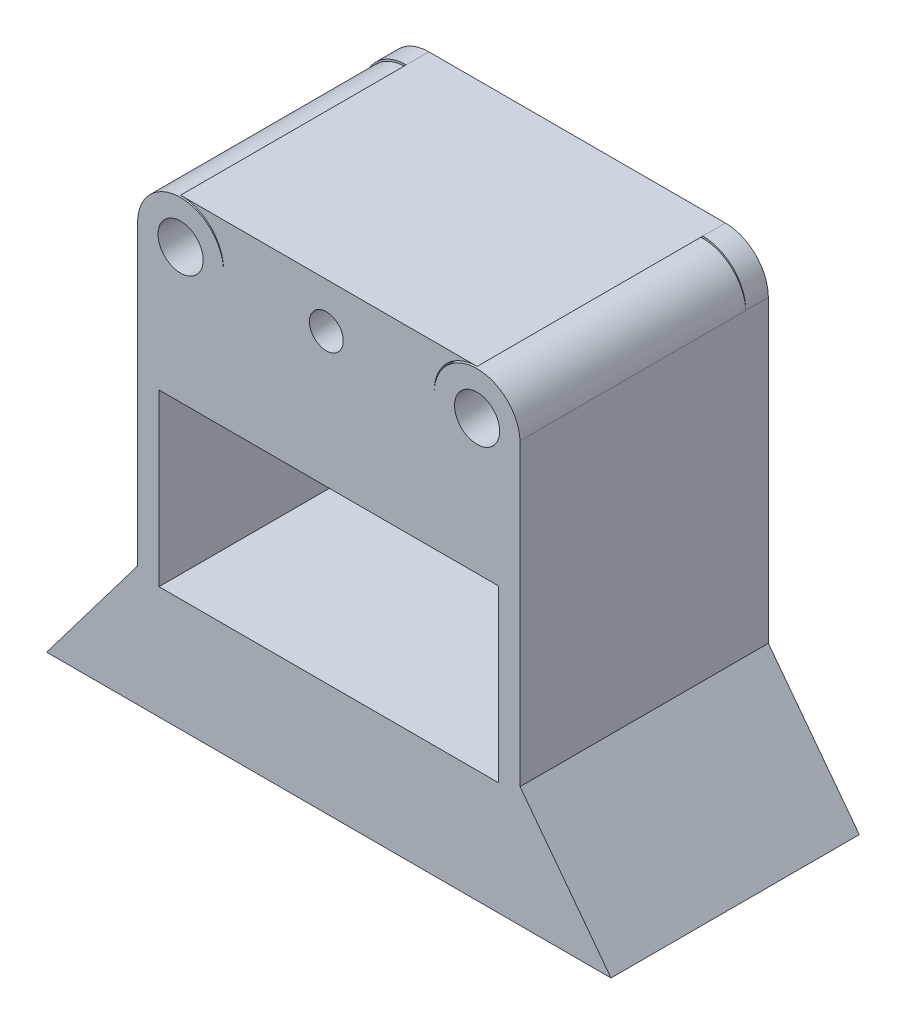
ISO-10303-21;
HEADER;
FILE_DESCRIPTION(('STEP AP214'),'2;1');
FILE_NAME('part.step','',(''),(''),'','','');
FILE_SCHEMA(('AUTOMOTIVE_DESIGN { 1 0 10303 214 1 1 1 1 }'));
ENDSEC;
DATA;
#1=APPLICATION_CONTEXT('core data for automotive mechanical design processes');
#2=APPLICATION_PROTOCOL_DEFINITION('international standard','automotive_design',2000,#1);
#3=PRODUCT_CONTEXT('',#1,'mechanical');
#4=PRODUCT('Part','Part','',(#3));
#5=PRODUCT_RELATED_PRODUCT_CATEGORY('part','',(#4));
#6=PRODUCT_DEFINITION_FORMATION('','',#4);
#7=PRODUCT_DEFINITION_CONTEXT('part definition',#1,'design');
#8=PRODUCT_DEFINITION('design','',#6,#7);
#9=PRODUCT_DEFINITION_SHAPE('','',#8);
#10=(LENGTH_UNIT() NAMED_UNIT(*) SI_UNIT(.MILLI.,.METRE.));
#11=(NAMED_UNIT(*) PLANE_ANGLE_UNIT() SI_UNIT($,.RADIAN.));
#12=(NAMED_UNIT(*) SI_UNIT($,.STERADIAN.) SOLID_ANGLE_UNIT());
#13=UNCERTAINTY_MEASURE_WITH_UNIT(LENGTH_MEASURE(1.E-05),#10,'distance_accuracy_value','');
#14=(GEOMETRIC_REPRESENTATION_CONTEXT(3) GLOBAL_UNCERTAINTY_ASSIGNED_CONTEXT((#13)) GLOBAL_UNIT_ASSIGNED_CONTEXT((#10,
#11,#12)) REPRESENTATION_CONTEXT('',''));
#15=CARTESIAN_POINT('',(0.,0.,0.));
#16=DIRECTION('',(0.,0.,1.));
#17=DIRECTION('',(1.,0.,0.));
#18=AXIS2_PLACEMENT_3D('',#15,#16,#17);
#19=CARTESIAN_POINT('',(-33.3647511090704,49.8910976898227,-5.08));
#20=DIRECTION('',(0.,0.,1.));
#21=DIRECTION('',(1.,0.,0.));
#22=AXIS2_PLACEMENT_3D('',#19,#20,#21);
#23=CYLINDRICAL_SURFACE('',#22,9.66521381037056);
#24=CARTESIAN_POINT('',(-33.3647511090704,49.8910976898227,0.));
#25=DIRECTION('',(0.,0.,-1.));
#26=DIRECTION('',(1.,0.,0.));
#27=AXIS2_PLACEMENT_3D('',#24,#25,#26);
#28=CIRCLE('',#27,9.66521381037056);
#29=CARTESIAN_POINT('',(-43.029964919441,49.8910976898227,0.));
#30=VERTEX_POINT('',#29);
#31=CARTESIAN_POINT('',(-33.3651265682882,59.5563112913761,0.));
#32=VERTEX_POINT('',#31);
#33=EDGE_CURVE('E271',#30,#32,#28,.T.);
#34=ORIENTED_EDGE('',*,*,#33,.T.);
#35=CARTESIAN_POINT('',(-33.3647511090704,59.5563100053707,-5.08));
#36=DIRECTION('',(0.,0.,1.));
#37=VECTOR('',#36,1.);
#38=LINE('',#35,#37);
#39=CARTESIAN_POINT('',(-33.3674388387925,59.556310752782,-5.08));
#40=VERTEX_POINT('',#39);
#41=EDGE_CURVE('E50',#40,#32,#38,.T.);
#42=ORIENTED_EDGE('',*,*,#41,.F.);
#43=CARTESIAN_POINT('',(-33.3647511090704,49.8910976898227,-5.08));
#44=DIRECTION('',(0.,0.,-1.));
#45=DIRECTION('',(1.,0.,0.));
#46=AXIS2_PLACEMENT_3D('',#43,#44,#45);
#47=CIRCLE('',#46,9.66521381037056);
#48=CARTESIAN_POINT('',(-43.029964919441,49.8910976898227,-5.08));
#49=VERTEX_POINT('',#48);
#50=EDGE_CURVE('E288',#49,#40,#47,.T.);
#51=ORIENTED_EDGE('',*,*,#50,.F.);
#52=DIRECTION('',(0.,0.,1.));
#53=VECTOR('',#52,1.);
#54=CARTESIAN_POINT('',(-43.029964919441,49.8910976898227,-5.08));
#55=LINE('',#54,#53);
#56=EDGE_CURVE('E282',#49,#30,#55,.T.);
#57=ORIENTED_EDGE('',*,*,#56,.T.);
#58=EDGE_LOOP('',(#34,#42,#51,#57));
#59=FACE_BOUND('',#58,.T.);
#60=ADVANCED_FACE('F33',(#59),#23,.T.);
#61=CARTESIAN_POINT('',(33.364499946,49.439500054,50.8));
#62=DIRECTION('',(0.,0.,1.));
#63=DIRECTION('',(1.,0.,0.));
#64=AXIS2_PLACEMENT_3D('',#61,#62,#63);
#65=PLANE('',#64);
#66=CARTESIAN_POINT('',(33.364499946,49.439500054,50.8));
#67=DIRECTION('',(0.,0.,1.));
#68=DIRECTION('',(1.,0.,0.));
#69=AXIS2_PLACEMENT_3D('',#66,#67,#68);
#70=CIRCLE('',#69,5.08);
#71=CARTESIAN_POINT('',(38.444499946,49.439500054,50.8));
#72=VERTEX_POINT('',#71);
#73=EDGE_CURVE('E216',#72,#72,#70,.T.);
#74=ORIENTED_EDGE('',*,*,#73,.F.);
#75=EDGE_LOOP('',(#74));
#76=FACE_BOUND('',#75,.T.);
#77=CARTESIAN_POINT('',(-33.364499946,49.439500054,50.8));
#78=DIRECTION('',(0.,0.,1.));
#79=DIRECTION('',(1.,0.,0.));
#80=AXIS2_PLACEMENT_3D('',#77,#78,#79);
#81=CIRCLE('',#80,5.08);
#82=CARTESIAN_POINT('',(-28.284499946,49.439500054,50.8));
#83=VERTEX_POINT('',#82);
#84=EDGE_CURVE('E210',#83,#83,#81,.T.);
#85=ORIENTED_EDGE('',*,*,#84,.F.);
#86=EDGE_LOOP('',(#85));
#87=FACE_BOUND('',#86,.T.);
#88=CARTESIAN_POINT('',(-0.569554056362109,49.4395000539998,50.8));
#89=DIRECTION('',(0.,0.,1.));
#90=DIRECTION('',(1.,0.,0.));
#91=AXIS2_PLACEMENT_3D('',#88,#89,#90);
#92=CIRCLE('',#91,3.81);
#93=CARTESIAN_POINT('',(3.24044594363789,49.4395000539998,50.8));
#94=VERTEX_POINT('',#93);
#95=EDGE_CURVE('E204',#94,#94,#92,.T.);
#96=ORIENTED_EDGE('',*,*,#95,.F.);
#97=EDGE_LOOP('',(#96));
#98=FACE_BOUND('',#97,.T.);
#99=DIRECTION('',(-0.603372043697109,-0.797459827756091,0.));
#100=VECTOR('',#99,1.);
#101=CARTESIAN_POINT('',(-43.029964919441,-17.5223314583823,50.8));
#102=LINE('',#101,#100);
#103=CARTESIAN_POINT('',(-43.029964919441,-17.5223314583823,50.8));
#104=VERTEX_POINT('',#103);
#105=CARTESIAN_POINT('',(-63.5,-44.577,50.8));
#106=VERTEX_POINT('',#105);
#107=EDGE_CURVE('E383',#104,#106,#102,.T.);
#108=ORIENTED_EDGE('',*,*,#107,.T.);
#109=DIRECTION('',(1.,0.,0.));
#110=VECTOR('',#109,1.);
#111=CARTESIAN_POINT('',(-63.5,-44.577,50.8));
#112=LINE('',#111,#110);
#113=CARTESIAN_POINT('',(63.5,-44.577,50.8));
#114=VERTEX_POINT('',#113);
#115=EDGE_CURVE('E381',#106,#114,#112,.T.);
#116=ORIENTED_EDGE('',*,*,#115,.T.);
#117=DIRECTION('',(-0.603372043697109,0.797459827756091,0.));
#118=VECTOR('',#117,1.);
#119=CARTESIAN_POINT('',(43.029964919441,-17.5223314583823,50.8));
#120=LINE('',#119,#118);
#121=CARTESIAN_POINT('',(43.029964919441,-17.5223314583823,50.8));
#122=VERTEX_POINT('',#121);
#123=EDGE_CURVE('E379',#114,#122,#120,.T.);
#124=ORIENTED_EDGE('',*,*,#123,.T.);
#125=DIRECTION('',(0.,1.,0.));
#126=VECTOR('',#125,1.);
#127=CARTESIAN_POINT('',(43.029964919441,-17.5223314583823,50.8));
#128=LINE('',#127,#126);
#129=CARTESIAN_POINT('',(43.029964919441,49.8910976898227,50.8));
#130=VERTEX_POINT('',#129);
#131=EDGE_CURVE('E377',#122,#130,#128,.T.);
#132=ORIENTED_EDGE('',*,*,#131,.T.);
#133=CARTESIAN_POINT('',(33.364499946,49.439500054,50.8));
#134=DIRECTION('',(0.,0.,1.));
#135=DIRECTION('',(1.,0.,0.));
#136=AXIS2_PLACEMENT_3D('',#133,#134,#135);
#137=CIRCLE('',#136,9.67600917617876);
#138=CARTESIAN_POINT('',(23.6995432779893,49.9018486053888,50.8));
#139=VERTEX_POINT('',#138);
#140=EDGE_CURVE('E168',#130,#139,#137,.T.);
#141=ORIENTED_EDGE('',*,*,#140,.T.);
#142=CARTESIAN_POINT('',(33.3701265676849,49.885713254783,50.8));
#143=DIRECTION('',(0.,0.,1.));
#144=DIRECTION('',(1.,0.,0.));
#145=AXIS2_PLACEMENT_3D('',#142,#143,#144);
#146=CIRCLE('',#145,9.67059675058774);
#147=CARTESIAN_POINT('',(33.3701265676849,59.5563100053707,50.8));
#148=VERTEX_POINT('',#147);
#149=EDGE_CURVE('E158',#148,#139,#146,.T.);
#150=ORIENTED_EDGE('',*,*,#149,.F.);
#151=DIRECTION('',(1.,0.,0.));
#152=VECTOR('',#151,1.);
#153=CARTESIAN_POINT('',(33.3701265676849,59.5563100053707,50.8));
#154=LINE('',#153,#152);
#155=CARTESIAN_POINT('',(-33.3701265676849,59.5563100053707,50.8));
#156=VERTEX_POINT('',#155);
#157=EDGE_CURVE('E165',#156,#148,#154,.T.);
#158=ORIENTED_EDGE('',*,*,#157,.F.);
#159=CARTESIAN_POINT('',(-33.3701265676849,49.885713254783,50.8));
#160=DIRECTION('',(0.,0.,1.));
#161=DIRECTION('',(1.,0.,0.));
#162=AXIS2_PLACEMENT_3D('',#159,#160,#161);
#163=CIRCLE('',#162,9.67059675058773);
#164=CARTESIAN_POINT('',(-23.6995432779893,49.9018486053888,50.8));
#165=VERTEX_POINT('',#164);
#166=EDGE_CURVE('E189',#165,#156,#163,.T.);
#167=ORIENTED_EDGE('',*,*,#166,.F.);
#168=CARTESIAN_POINT('',(-33.364499946,49.439500054,50.8));
#169=DIRECTION('',(0.,0.,1.));
#170=DIRECTION('',(-1.,0.,0.));
#171=AXIS2_PLACEMENT_3D('',#168,#169,#170);
#172=CIRCLE('',#171,9.67600917617876);
#173=CARTESIAN_POINT('',(-43.029964919441,49.8910976898227,50.8));
#174=VERTEX_POINT('',#173);
#175=EDGE_CURVE('E374',#165,#174,#172,.T.);
#176=ORIENTED_EDGE('',*,*,#175,.T.);
#177=DIRECTION('',(0.,-1.,0.));
#178=VECTOR('',#177,1.);
#179=CARTESIAN_POINT('',(-43.029964919441,19.177,50.8));
#180=LINE('',#179,#178);
#181=EDGE_CURVE('E372',#174,#104,#180,.T.);
#182=ORIENTED_EDGE('',*,*,#181,.T.);
#183=EDGE_LOOP('',(#108,#116,#124,#132,#141,#150,#158,#167,#176,#182));
#184=FACE_BOUND('',#183,.T.);
#185=DIRECTION('',(-1.,0.,0.));
#186=VECTOR('',#185,1.);
#187=CARTESIAN_POINT('',(-38.227,19.177,50.8));
#188=LINE('',#187,#186);
#189=CARTESIAN_POINT('',(38.227,19.177,50.8));
#190=VERTEX_POINT('',#189);
#191=CARTESIAN_POINT('',(-38.227,19.177,50.8));
#192=VERTEX_POINT('',#191);
#193=EDGE_CURVE('E412',#190,#192,#188,.T.);
#194=ORIENTED_EDGE('',*,*,#193,.F.);
#195=DIRECTION('',(0.,1.,0.));
#196=VECTOR('',#195,1.);
#197=CARTESIAN_POINT('',(38.227,-19.177,50.8));
#198=LINE('',#197,#196);
#199=CARTESIAN_POINT('',(38.227,-19.177,50.8));
#200=VERTEX_POINT('',#199);
#201=EDGE_CURVE('E399',#200,#190,#198,.T.);
#202=ORIENTED_EDGE('',*,*,#201,.F.);
#203=DIRECTION('',(1.,0.,0.));
#204=VECTOR('',#203,1.);
#205=CARTESIAN_POINT('',(-38.227,-19.177,50.8));
#206=LINE('',#205,#204);
#207=CARTESIAN_POINT('',(-38.227,-19.177,50.8));
#208=VERTEX_POINT('',#207);
#209=EDGE_CURVE('E395',#208,#200,#206,.T.);
#210=ORIENTED_EDGE('',*,*,#209,.F.);
#211=DIRECTION('',(0.,-1.,0.));
#212=VECTOR('',#211,1.);
#213=CARTESIAN_POINT('',(-38.227,-19.177,50.8));
#214=LINE('',#213,#212);
#215=EDGE_CURVE('E410',#192,#208,#214,.T.);
#216=ORIENTED_EDGE('',*,*,#215,.F.);
#217=EDGE_LOOP('',(#194,#202,#210,#216));
#218=FACE_BOUND('',#217,.T.);
#219=ADVANCED_FACE('F161',(#76,#87,#98,#184,#218),#65,.T.);
#220=CARTESIAN_POINT('',(-43.029964919441,-17.5223314583823,50.8));
#221=DIRECTION('',(0.797459827756091,-0.603372043697109,0.));
#222=DIRECTION('',(0.603372043697109,0.797459827756091,0.));
#223=AXIS2_PLACEMENT_3D('',#220,#221,#222);
#224=PLANE('',#223);
#225=DIRECTION('',(0.,0.,-1.));
#226=VECTOR('',#225,1.);
#227=CARTESIAN_POINT('',(-43.029964919441,-17.5223314583823,50.8));
#228=LINE('',#227,#226);
#229=CARTESIAN_POINT('',(-43.029964919441,-17.5223314583823,-5.08));
#230=VERTEX_POINT('',#229);
#231=EDGE_CURVE('E370',#104,#230,#228,.T.);
#232=ORIENTED_EDGE('',*,*,#231,.T.);
#233=DIRECTION('',(0.603372043697109,0.797459827756091,0.));
#234=VECTOR('',#233,1.);
#235=CARTESIAN_POINT('',(-63.5,-44.577,-5.08));
#236=LINE('',#235,#234);
#237=CARTESIAN_POINT('',(-63.5,-44.577,-5.08));
#238=VERTEX_POINT('',#237);
#239=EDGE_CURVE('E293',#238,#230,#236,.T.);
#240=ORIENTED_EDGE('',*,*,#239,.F.);
#241=DIRECTION('',(0.,0.,-1.));
#242=VECTOR('',#241,1.);
#243=CARTESIAN_POINT('',(-63.5,-44.577,50.8));
#244=LINE('',#243,#242);
#245=EDGE_CURVE('E286',#106,#238,#244,.T.);
#246=ORIENTED_EDGE('',*,*,#245,.F.);
#247=ORIENTED_EDGE('',*,*,#107,.F.);
#248=EDGE_LOOP('',(#232,#240,#246,#247));
#249=FACE_BOUND('',#248,.T.);
#250=ADVANCED_FACE('F35',(#249),#224,.F.);
#251=CARTESIAN_POINT('',(-63.5,-44.577,50.8));
#252=DIRECTION('',(0.,1.,0.));
#253=DIRECTION('',(0.,0.,1.));
#254=AXIS2_PLACEMENT_3D('',#251,#252,#253);
#255=PLANE('',#254);
#256=ORIENTED_EDGE('',*,*,#245,.T.);
#257=DIRECTION('',(-1.,0.,0.));
#258=VECTOR('',#257,1.);
#259=CARTESIAN_POINT('',(63.5,-44.577,-5.08));
#260=LINE('',#259,#258);
#261=CARTESIAN_POINT('',(63.5,-44.577,-5.08));
#262=VERTEX_POINT('',#261);
#263=EDGE_CURVE('E297',#262,#238,#260,.T.);
#264=ORIENTED_EDGE('',*,*,#263,.F.);
#265=DIRECTION('',(0.,0.,-1.));
#266=VECTOR('',#265,1.);
#267=CARTESIAN_POINT('',(63.5,-44.577,50.8));
#268=LINE('',#267,#266);
#269=EDGE_CURVE('E352',#114,#262,#268,.T.);
#270=ORIENTED_EDGE('',*,*,#269,.F.);
#271=ORIENTED_EDGE('',*,*,#115,.F.);
#272=EDGE_LOOP('',(#256,#264,#270,#271));
#273=FACE_BOUND('',#272,.T.);
#274=ADVANCED_FACE('F464',(#273),#255,.F.);
#275=CARTESIAN_POINT('',(43.029964919441,-17.5223314583823,50.8));
#276=DIRECTION('',(-0.797459827756091,-0.603372043697109,0.));
#277=DIRECTION('',(0.603372043697109,-0.797459827756091,0.));
#278=AXIS2_PLACEMENT_3D('',#275,#276,#277);
#279=PLANE('',#278);
#280=ORIENTED_EDGE('',*,*,#269,.T.);
#281=DIRECTION('',(0.603372043697109,-0.797459827756091,0.));
#282=VECTOR('',#281,1.);
#283=CARTESIAN_POINT('',(43.029964919441,-17.5223314583823,-5.08));
#284=LINE('',#283,#282);
#285=CARTESIAN_POINT('',(43.029964919441,-17.5223314583823,-5.08));
#286=VERTEX_POINT('',#285);
#287=EDGE_CURVE('E302',#286,#262,#284,.T.);
#288=ORIENTED_EDGE('',*,*,#287,.F.);
#289=DIRECTION('',(0.,0.,-1.));
#290=VECTOR('',#289,1.);
#291=CARTESIAN_POINT('',(43.029964919441,-17.5223314583823,50.8));
#292=LINE('',#291,#290);
#293=EDGE_CURVE('E356',#122,#286,#292,.T.);
#294=ORIENTED_EDGE('',*,*,#293,.F.);
#295=ORIENTED_EDGE('',*,*,#123,.F.);
#296=EDGE_LOOP('',(#280,#288,#294,#295));
#297=FACE_BOUND('',#296,.T.);
#298=ADVANCED_FACE('F462',(#297),#279,.F.);
#299=CARTESIAN_POINT('',(43.029964919441,19.177,50.8));
#300=DIRECTION('',(-1.,0.,0.));
#301=DIRECTION('',(0.,0.,1.));
#302=AXIS2_PLACEMENT_3D('',#299,#300,#301);
#303=PLANE('',#302);
#304=ORIENTED_EDGE('',*,*,#293,.T.);
#305=DIRECTION('',(0.,-1.,0.));
#306=VECTOR('',#305,1.);
#307=CARTESIAN_POINT('',(43.029964919441,49.8910976898227,-5.08));
#308=LINE('',#307,#306);
#309=CARTESIAN_POINT('',(43.029964919441,49.8910976898227,-5.08));
#310=VERTEX_POINT('',#309);
#311=EDGE_CURVE('E305',#310,#286,#308,.T.);
#312=ORIENTED_EDGE('',*,*,#311,.F.);
#313=DIRECTION('',(0.,0.,1.));
#314=VECTOR('',#313,1.);
#315=CARTESIAN_POINT('',(43.029964919441,49.8910976898227,-5.08));
#316=LINE('',#315,#314);
#317=CARTESIAN_POINT('',(43.029964919441,49.8910976898227,0.));
#318=VERTEX_POINT('',#317);
#319=EDGE_CURVE('E292',#310,#318,#316,.T.);
#320=ORIENTED_EDGE('',*,*,#319,.T.);
#321=DIRECTION('',(0.,0.,-1.));
#322=VECTOR('',#321,1.);
#323=CARTESIAN_POINT('',(43.029964919441,49.8910976898227,50.8));
#324=LINE('',#323,#322);
#325=EDGE_CURVE('E361',#130,#318,#324,.T.);
#326=ORIENTED_EDGE('',*,*,#325,.F.);
#327=ORIENTED_EDGE('',*,*,#131,.F.);
#328=EDGE_LOOP('',(#304,#312,#320,#326,#327));
#329=FACE_BOUND('',#328,.T.);
#330=ADVANCED_FACE('F419',(#329),#303,.F.);
#331=CARTESIAN_POINT('',(33.364499946,49.439500054,50.8));
#332=DIRECTION('',(0.,0.,-1.));
#333=DIRECTION('',(-1.,0.,0.));
#334=AXIS2_PLACEMENT_3D('',#331,#332,#333);
#335=CYLINDRICAL_SURFACE('',#334,9.67600917617876);
#336=CARTESIAN_POINT('',(33.364499946,49.439500054,0.));
#337=DIRECTION('',(0.,0.,1.));
#338=DIRECTION('',(1.,0.,0.));
#339=AXIS2_PLACEMENT_3D('',#336,#337,#338);
#340=CIRCLE('',#339,9.67600917617876);
#341=CARTESIAN_POINT('',(23.6995432779893,49.9018486053888,0.));
#342=VERTEX_POINT('',#341);
#343=EDGE_CURVE('E389',#318,#342,#340,.T.);
#344=ORIENTED_EDGE('',*,*,#343,.T.);
#345=DIRECTION('',(0.,0.,-1.));
#346=VECTOR('',#345,1.);
#347=CARTESIAN_POINT('',(23.6995432779893,49.9018486053888,50.8));
#348=LINE('',#347,#346);
#349=EDGE_CURVE('E366',#139,#342,#348,.T.);
#350=ORIENTED_EDGE('',*,*,#349,.F.);
#351=ORIENTED_EDGE('',*,*,#140,.F.);
#352=ORIENTED_EDGE('',*,*,#325,.T.);
#353=EDGE_LOOP('',(#344,#350,#351,#352));
#354=FACE_BOUND('',#353,.T.);
#355=ADVANCED_FACE('F424',(#354),#335,.T.);
#356=CARTESIAN_POINT('',(-33.364499946,49.439500054,50.8));
#357=DIRECTION('',(0.,0.,-1.));
#358=DIRECTION('',(-1.,0.,0.));
#359=AXIS2_PLACEMENT_3D('',#356,#357,#358);
#360=CYLINDRICAL_SURFACE('',#359,9.67600917617876);
#361=CARTESIAN_POINT('',(-33.364499946,49.439500054,0.));
#362=DIRECTION('',(0.,0.,1.));
#363=DIRECTION('',(-1.,0.,0.));
#364=AXIS2_PLACEMENT_3D('',#361,#362,#363);
#365=CIRCLE('',#364,9.67600917617876);
#366=CARTESIAN_POINT('',(-23.6995432779893,49.9018486053888,0.));
#367=VERTEX_POINT('',#366);
#368=EDGE_CURVE('E385',#367,#30,#365,.T.);
#369=ORIENTED_EDGE('',*,*,#368,.T.);
#370=DIRECTION('',(0.,0.,-1.));
#371=VECTOR('',#370,1.);
#372=CARTESIAN_POINT('',(-43.029964919441,49.8910976898227,50.8));
#373=LINE('',#372,#371);
#374=EDGE_CURVE('E367',#174,#30,#373,.T.);
#375=ORIENTED_EDGE('',*,*,#374,.F.);
#376=ORIENTED_EDGE('',*,*,#175,.F.);
#377=DIRECTION('',(0.,0.,-1.));
#378=VECTOR('',#377,1.);
#379=CARTESIAN_POINT('',(-23.6995432779893,49.9018486053888,50.8));
#380=LINE('',#379,#378);
#381=EDGE_CURVE('E351',#165,#367,#380,.T.);
#382=ORIENTED_EDGE('',*,*,#381,.T.);
#383=EDGE_LOOP('',(#369,#375,#376,#382));
#384=FACE_BOUND('',#383,.T.);
#385=ADVANCED_FACE('F473',(#384),#360,.T.);
#386=CARTESIAN_POINT('',(-43.029964919441,-17.5223314583823,50.8));
#387=DIRECTION('',(1.,0.,0.));
#388=DIRECTION('',(0.,0.,-1.));
#389=AXIS2_PLACEMENT_3D('',#386,#387,#388);
#390=PLANE('',#389);
#391=ORIENTED_EDGE('',*,*,#374,.T.);
#392=ORIENTED_EDGE('',*,*,#56,.F.);
#393=DIRECTION('',(0.,1.,0.));
#394=VECTOR('',#393,1.);
#395=CARTESIAN_POINT('',(-43.029964919441,-17.5223314583823,-5.08));
#396=LINE('',#395,#394);
#397=EDGE_CURVE('E289',#230,#49,#396,.T.);
#398=ORIENTED_EDGE('',*,*,#397,.F.);
#399=ORIENTED_EDGE('',*,*,#231,.F.);
#400=ORIENTED_EDGE('',*,*,#181,.F.);
#401=EDGE_LOOP('',(#391,#392,#398,#399,#400));
#402=FACE_BOUND('',#401,.T.);
#403=ADVANCED_FACE('F470',(#402),#390,.F.);
#404=CARTESIAN_POINT('',(38.227,-19.177,50.8));
#405=DIRECTION('',(-1.,0.,0.));
#406=DIRECTION('',(0.,0.,1.));
#407=AXIS2_PLACEMENT_3D('',#404,#405,#406);
#408=PLANE('',#407);
#409=DIRECTION('',(0.,1.,0.));
#410=VECTOR('',#409,1.);
#411=CARTESIAN_POINT('',(38.227,-19.177,0.));
#412=LINE('',#411,#410);
#413=CARTESIAN_POINT('',(38.227,-19.177,0.));
#414=VERTEX_POINT('',#413);
#415=CARTESIAN_POINT('',(38.227,19.177,0.));
#416=VERTEX_POINT('',#415);
#417=EDGE_CURVE('E406',#414,#416,#412,.T.);
#418=ORIENTED_EDGE('',*,*,#417,.F.);
#419=DIRECTION('',(0.,0.,-1.));
#420=VECTOR('',#419,1.);
#421=CARTESIAN_POINT('',(38.227,-19.177,50.8));
#422=LINE('',#421,#420);
#423=EDGE_CURVE('E393',#200,#414,#422,.T.);
#424=ORIENTED_EDGE('',*,*,#423,.F.);
#425=ORIENTED_EDGE('',*,*,#201,.T.);
#426=DIRECTION('',(0.,0.,-1.));
#427=VECTOR('',#426,1.);
#428=CARTESIAN_POINT('',(38.227,19.177,50.8));
#429=LINE('',#428,#427);
#430=EDGE_CURVE('E386',#190,#416,#429,.T.);
#431=ORIENTED_EDGE('',*,*,#430,.T.);
#432=EDGE_LOOP('',(#418,#424,#425,#431));
#433=FACE_BOUND('',#432,.T.);
#434=ADVANCED_FACE('F480',(#433),#408,.T.);
#435=CARTESIAN_POINT('',(-38.227,19.177,50.8));
#436=DIRECTION('',(0.,-1.,0.));
#437=DIRECTION('',(0.,0.,-1.));
#438=AXIS2_PLACEMENT_3D('',#435,#436,#437);
#439=PLANE('',#438);
#440=DIRECTION('',(-1.,0.,0.));
#441=VECTOR('',#440,1.);
#442=CARTESIAN_POINT('',(-38.227,19.177,0.));
#443=LINE('',#442,#441);
#444=CARTESIAN_POINT('',(-38.227,19.177,0.));
#445=VERTEX_POINT('',#444);
#446=EDGE_CURVE('E403',#416,#445,#443,.T.);
#447=ORIENTED_EDGE('',*,*,#446,.F.);
#448=ORIENTED_EDGE('',*,*,#430,.F.);
#449=ORIENTED_EDGE('',*,*,#193,.T.);
#450=DIRECTION('',(0.,0.,-1.));
#451=VECTOR('',#450,1.);
#452=CARTESIAN_POINT('',(-38.227,19.177,50.8));
#453=LINE('',#452,#451);
#454=EDGE_CURVE('E390',#192,#445,#453,.T.);
#455=ORIENTED_EDGE('',*,*,#454,.T.);
#456=EDGE_LOOP('',(#447,#448,#449,#455));
#457=FACE_BOUND('',#456,.T.);
#458=ADVANCED_FACE('F532',(#457),#439,.T.);
#459=CARTESIAN_POINT('',(-38.227,-19.177,50.8));
#460=DIRECTION('',(1.,0.,0.));
#461=DIRECTION('',(0.,0.,-1.));
#462=AXIS2_PLACEMENT_3D('',#459,#460,#461);
#463=PLANE('',#462);
#464=DIRECTION('',(0.,-1.,0.));
#465=VECTOR('',#464,1.);
#466=CARTESIAN_POINT('',(-38.227,-19.177,0.));
#467=LINE('',#466,#465);
#468=CARTESIAN_POINT('',(-38.227,-19.177,0.));
#469=VERTEX_POINT('',#468);
#470=EDGE_CURVE('E400',#445,#469,#467,.T.);
#471=ORIENTED_EDGE('',*,*,#470,.F.);
#472=ORIENTED_EDGE('',*,*,#454,.F.);
#473=ORIENTED_EDGE('',*,*,#215,.T.);
#474=DIRECTION('',(0.,0.,-1.));
#475=VECTOR('',#474,1.);
#476=CARTESIAN_POINT('',(-38.227,-19.177,50.8));
#477=LINE('',#476,#475);
#478=EDGE_CURVE('E78',#208,#469,#477,.T.);
#479=ORIENTED_EDGE('',*,*,#478,.T.);
#480=EDGE_LOOP('',(#471,#472,#473,#479));
#481=FACE_BOUND('',#480,.T.);
#482=ADVANCED_FACE('F542',(#481),#463,.T.);
#483=CARTESIAN_POINT('',(-38.227,-19.177,50.8));
#484=DIRECTION('',(0.,1.,0.));
#485=DIRECTION('',(0.,0.,1.));
#486=AXIS2_PLACEMENT_3D('',#483,#484,#485);
#487=PLANE('',#486);
#488=DIRECTION('',(1.,0.,0.));
#489=VECTOR('',#488,1.);
#490=CARTESIAN_POINT('',(-38.227,-19.177,0.));
#491=LINE('',#490,#489);
#492=EDGE_CURVE('E396',#469,#414,#491,.T.);
#493=ORIENTED_EDGE('',*,*,#492,.F.);
#494=ORIENTED_EDGE('',*,*,#478,.F.);
#495=ORIENTED_EDGE('',*,*,#209,.T.);
#496=ORIENTED_EDGE('',*,*,#423,.T.);
#497=EDGE_LOOP('',(#493,#494,#495,#496));
#498=FACE_BOUND('',#497,.T.);
#499=ADVANCED_FACE('F552',(#498),#487,.T.);
#500=CARTESIAN_POINT('',(33.3647511090705,49.8910976898227,0.));
#501=DIRECTION('',(0.,0.,1.));
#502=DIRECTION('',(1.,0.,0.));
#503=AXIS2_PLACEMENT_3D('',#500,#501,#502);
#504=PLANE('',#503);
#505=ORIENTED_EDGE('',*,*,#492,.T.);
#506=ORIENTED_EDGE('',*,*,#417,.T.);
#507=ORIENTED_EDGE('',*,*,#446,.T.);
#508=ORIENTED_EDGE('',*,*,#470,.T.);
#509=EDGE_LOOP('',(#505,#506,#507,#508));
#510=FACE_BOUND('',#509,.T.);
#511=ADVANCED_FACE('F560',(#510),#504,.T.);
#512=CARTESIAN_POINT('',(33.3647511090705,49.8910976898227,-5.08));
#513=DIRECTION('',(0.,0.,1.));
#514=DIRECTION('',(1.,0.,0.));
#515=AXIS2_PLACEMENT_3D('',#512,#513,#514);
#516=PLANE('',#515);
#517=ORIENTED_EDGE('',*,*,#50,.T.);
#518=DIRECTION('',(1.,0.,0.));
#519=VECTOR('',#518,1.);
#520=CARTESIAN_POINT('',(33.3701265676849,59.5563100053707,-5.08));
#521=LINE('',#520,#519);
#522=CARTESIAN_POINT('',(33.3674388387909,59.556310752782,-5.08));
#523=VERTEX_POINT('',#522);
#524=EDGE_CURVE('E191',#40,#523,#521,.T.);
#525=ORIENTED_EDGE('',*,*,#524,.T.);
#526=CARTESIAN_POINT('',(33.3647511090705,49.8910976898227,-5.08));
#527=DIRECTION('',(0.,0.,-1.));
#528=DIRECTION('',(1.,0.,0.));
#529=AXIS2_PLACEMENT_3D('',#526,#527,#528);
#530=CIRCLE('',#529,9.66521381037055);
#531=EDGE_CURVE('E272',#523,#310,#530,.T.);
#532=ORIENTED_EDGE('',*,*,#531,.T.);
#533=ORIENTED_EDGE('',*,*,#311,.T.);
#534=ORIENTED_EDGE('',*,*,#287,.T.);
#535=ORIENTED_EDGE('',*,*,#263,.T.);
#536=ORIENTED_EDGE('',*,*,#239,.T.);
#537=ORIENTED_EDGE('',*,*,#397,.T.);
#538=EDGE_LOOP('',(#517,#525,#532,#533,#534,#535,#536,#537));
#539=FACE_BOUND('',#538,.T.);
#540=ADVANCED_FACE('F460',(#539),#516,.F.);
#541=CARTESIAN_POINT('',(33.3647511090705,49.8910976898227,-5.08));
#542=DIRECTION('',(0.,0.,1.));
#543=DIRECTION('',(1.,0.,0.));
#544=AXIS2_PLACEMENT_3D('',#541,#542,#543);
#545=CYLINDRICAL_SURFACE('',#544,9.66521381037055);
#546=ORIENTED_EDGE('',*,*,#531,.F.);
#547=CARTESIAN_POINT('',(33.3647511090705,59.5563100053707,0.));
#548=DIRECTION('',(0.,0.,-1.));
#549=VECTOR('',#548,1.);
#550=LINE('',#547,#549);
#551=CARTESIAN_POINT('',(33.3651265682859,59.5563112913761,0.));
#552=VERTEX_POINT('',#551);
#553=EDGE_CURVE('E172',#552,#523,#550,.T.);
#554=ORIENTED_EDGE('',*,*,#553,.F.);
#555=CARTESIAN_POINT('',(33.3647511090705,49.8910976898227,0.));
#556=DIRECTION('',(0.,0.,-1.));
#557=DIRECTION('',(1.,0.,0.));
#558=AXIS2_PLACEMENT_3D('',#555,#556,#557);
#559=CIRCLE('',#558,9.66521381037055);
#560=EDGE_CURVE('E63',#552,#318,#559,.T.);
#561=ORIENTED_EDGE('',*,*,#560,.T.);
#562=ORIENTED_EDGE('',*,*,#319,.F.);
#563=EDGE_LOOP('',(#546,#554,#561,#562));
#564=FACE_BOUND('',#563,.T.);
#565=ADVANCED_FACE('F256',(#564),#545,.T.);
#566=CARTESIAN_POINT('',(33.3701265676849,49.885713254783,0.));
#567=DIRECTION('',(0.,0.,-1.));
#568=DIRECTION('',(-0.99999860805982,0.00166849585624378,0.));
#569=AXIS2_PLACEMENT_3D('',#566,#567,#568);
#570=CIRCLE('',#569,9.67059675058774);
#571=EDGE_CURVE('E11',#342,#552,#570,.T.);
#572=ORIENTED_EDGE('',*,*,#571,.F.);
#573=ORIENTED_EDGE('',*,*,#343,.F.);
#574=ORIENTED_EDGE('',*,*,#560,.F.);
#575=EDGE_LOOP('',(#572,#573,#574));
#576=FACE_BOUND('',#575,.T.);
#577=ADVANCED_FACE('F578',(#576),#504,.T.);
#578=CARTESIAN_POINT('',(-33.3701265676849,49.885713254783,0.));
#579=DIRECTION('',(0.,0.,-1.));
#580=DIRECTION('',(0.000277927957572724,0.999999961378024,0.));
#581=AXIS2_PLACEMENT_3D('',#578,#579,#580);
#582=CIRCLE('',#581,9.67059675058773);
#583=EDGE_CURVE('E43',#32,#367,#582,.T.);
#584=ORIENTED_EDGE('',*,*,#583,.F.);
#585=ORIENTED_EDGE('',*,*,#33,.F.);
#586=ORIENTED_EDGE('',*,*,#368,.F.);
#587=EDGE_LOOP('',(#584,#585,#586));
#588=FACE_BOUND('',#587,.T.);
#589=ADVANCED_FACE('F322',(#588),#504,.T.);
#590=CARTESIAN_POINT('',(33.3701265676849,59.5563100053707,126.300348843091));
#591=DIRECTION('',(0.,1.,0.));
#592=DIRECTION('',(-1.,0.,0.));
#593=AXIS2_PLACEMENT_3D('',#590,#591,#592);
#594=PLANE('',#593);
#595=DIRECTION('',(0.,0.,-1.));
#596=VECTOR('',#595,1.);
#597=CARTESIAN_POINT('',(33.3701265676849,59.5563100053707,126.300348843091));
#598=LINE('',#597,#596);
#599=EDGE_CURVE('E173',#148,#552,#598,.T.);
#600=ORIENTED_EDGE('',*,*,#599,.T.);
#601=ORIENTED_EDGE('',*,*,#553,.T.);
#602=ORIENTED_EDGE('',*,*,#524,.F.);
#603=ORIENTED_EDGE('',*,*,#41,.T.);
#604=DIRECTION('',(0.,0.,-1.));
#605=VECTOR('',#604,1.);
#606=CARTESIAN_POINT('',(-33.3701265676849,59.5563100053707,126.300348843091));
#607=LINE('',#606,#605);
#608=EDGE_CURVE('E183',#156,#32,#607,.T.);
#609=ORIENTED_EDGE('',*,*,#608,.F.);
#610=ORIENTED_EDGE('',*,*,#157,.T.);
#611=EDGE_LOOP('',(#600,#601,#602,#603,#609,#610));
#612=FACE_BOUND('',#611,.T.);
#613=ADVANCED_FACE('F181',(#612),#594,.T.);
#614=CARTESIAN_POINT('',(-33.3701265676849,49.885713254783,126.300348843091));
#615=DIRECTION('',(0.,0.,-1.));
#616=DIRECTION('',(-1.,0.,0.));
#617=AXIS2_PLACEMENT_3D('',#614,#615,#616);
#618=CYLINDRICAL_SURFACE('',#617,9.67059675058773);
#619=ORIENTED_EDGE('',*,*,#608,.T.);
#620=ORIENTED_EDGE('',*,*,#583,.T.);
#621=ORIENTED_EDGE('',*,*,#381,.F.);
#622=ORIENTED_EDGE('',*,*,#166,.T.);
#623=EDGE_LOOP('',(#619,#620,#621,#622));
#624=FACE_BOUND('',#623,.T.);
#625=ADVANCED_FACE('F241',(#624),#618,.F.);
#626=CARTESIAN_POINT('',(33.3701265676849,49.885713254783,126.300348843091));
#627=DIRECTION('',(0.,0.,-1.));
#628=DIRECTION('',(-1.,0.,0.));
#629=AXIS2_PLACEMENT_3D('',#626,#627,#628);
#630=CYLINDRICAL_SURFACE('',#629,9.67059675058774);
#631=ORIENTED_EDGE('',*,*,#571,.T.);
#632=ORIENTED_EDGE('',*,*,#599,.F.);
#633=ORIENTED_EDGE('',*,*,#149,.T.);
#634=ORIENTED_EDGE('',*,*,#349,.T.);
#635=EDGE_LOOP('',(#631,#632,#633,#634));
#636=FACE_BOUND('',#635,.T.);
#637=ADVANCED_FACE('F176',(#636),#630,.F.);
#638=CARTESIAN_POINT('',(-0.569554056362109,49.4395000539998,-10.776307345283));
#639=DIRECTION('',(0.,0.,1.));
#640=DIRECTION('',(1.,0.,0.));
#641=AXIS2_PLACEMENT_3D('',#638,#639,#640);
#642=CYLINDRICAL_SURFACE('',#641,3.81);
#643=CARTESIAN_POINT('',(-0.569554056362109,49.4395000539998,0.));
#644=DIRECTION('',(0.,0.,1.));
#645=DIRECTION('',(1.,0.,0.));
#646=AXIS2_PLACEMENT_3D('',#643,#644,#645);
#647=CIRCLE('',#646,3.81);
#648=CARTESIAN_POINT('',(3.24044594363789,49.4395000539998,0.));
#649=VERTEX_POINT('',#648);
#650=EDGE_CURVE('E198',#649,#649,#647,.F.);
#651=CARTESIAN_POINT('',(3.24044594363789,49.4395000539998,0.));
#652=CARTESIAN_POINT('',(3.24044594363789,49.4395000539998,0.529166666666665));
#653=CARTESIAN_POINT('',(3.24044594363789,49.4395000539998,1.05833333333333));
#654=CARTESIAN_POINT('',(3.24044594363789,49.4395000539998,2.11666666666666));
#655=CARTESIAN_POINT('',(3.24044594363789,49.4395000539998,2.64583333333333));
#656=CARTESIAN_POINT('',(3.24044594363789,49.4395000539998,3.70416666666667));
#657=CARTESIAN_POINT('',(3.24044594363789,49.4395000539998,4.23333333333333));
#658=CARTESIAN_POINT('',(3.24044594363789,49.4395000539998,5.29166666666667));
#659=CARTESIAN_POINT('',(3.24044594363789,49.4395000539998,5.82083333333333));
#660=CARTESIAN_POINT('',(3.24044594363789,49.4395000539998,6.87916666666666));
#661=CARTESIAN_POINT('',(3.24044594363789,49.4395000539998,7.40833333333333));
#662=CARTESIAN_POINT('',(3.24044594363789,49.4395000539998,8.46666666666666));
#663=CARTESIAN_POINT('',(3.24044594363789,49.4395000539998,8.99583333333333));
#664=CARTESIAN_POINT('',(3.24044594363789,49.4395000539998,10.0541666666667));
#665=CARTESIAN_POINT('',(3.24044594363789,49.4395000539998,10.5833333333333));
#666=CARTESIAN_POINT('',(3.24044594363789,49.4395000539998,11.6416666666667));
#667=CARTESIAN_POINT('',(3.24044594363789,49.4395000539998,12.1708333333333));
#668=CARTESIAN_POINT('',(3.24044594363789,49.4395000539998,13.2291666666667));
#669=CARTESIAN_POINT('',(3.24044594363789,49.4395000539998,13.7583333333333));
#670=CARTESIAN_POINT('',(3.24044594363789,49.4395000539998,14.8166666666667));
#671=CARTESIAN_POINT('',(3.24044594363789,49.4395000539998,15.3458333333333));
#672=CARTESIAN_POINT('',(3.24044594363789,49.4395000539998,16.4041666666667));
#673=CARTESIAN_POINT('',(3.24044594363789,49.4395000539998,16.9333333333333));
#674=CARTESIAN_POINT('',(3.24044594363789,49.4395000539998,17.9916666666667));
#675=CARTESIAN_POINT('',(3.24044594363789,49.4395000539998,18.5208333333333));
#676=CARTESIAN_POINT('',(3.24044594363789,49.4395000539998,19.5791666666667));
#677=CARTESIAN_POINT('',(3.24044594363789,49.4395000539998,20.1083333333333));
#678=CARTESIAN_POINT('',(3.24044594363789,49.4395000539998,21.1666666666667));
#679=CARTESIAN_POINT('',(3.24044594363789,49.4395000539998,21.6958333333333));
#680=CARTESIAN_POINT('',(3.24044594363789,49.4395000539998,22.7541666666667));
#681=CARTESIAN_POINT('',(3.24044594363789,49.4395000539998,23.2833333333333));
#682=CARTESIAN_POINT('',(3.24044594363789,49.4395000539998,24.3416666666667));
#683=CARTESIAN_POINT('',(3.24044594363789,49.4395000539998,24.8708333333333));
#684=CARTESIAN_POINT('',(3.24044594363789,49.4395000539998,25.9291666666667));
#685=CARTESIAN_POINT('',(3.24044594363789,49.4395000539998,26.4583333333333));
#686=CARTESIAN_POINT('',(3.24044594363789,49.4395000539998,27.5166666666667));
#687=CARTESIAN_POINT('',(3.24044594363789,49.4395000539998,28.0458333333333));
#688=CARTESIAN_POINT('',(3.24044594363789,49.4395000539998,29.1041666666667));
#689=CARTESIAN_POINT('',(3.24044594363789,49.4395000539998,29.6333333333333));
#690=CARTESIAN_POINT('',(3.24044594363789,49.4395000539998,30.6916666666667));
#691=CARTESIAN_POINT('',(3.24044594363789,49.4395000539998,31.2208333333333));
#692=CARTESIAN_POINT('',(3.24044594363789,49.4395000539998,32.2791666666667));
#693=CARTESIAN_POINT('',(3.24044594363789,49.4395000539998,32.8083333333333));
#694=CARTESIAN_POINT('',(3.24044594363789,49.4395000539998,33.8666666666667));
#695=CARTESIAN_POINT('',(3.24044594363789,49.4395000539998,34.3958333333333));
#696=CARTESIAN_POINT('',(3.24044594363789,49.4395000539998,35.4541666666667));
#697=CARTESIAN_POINT('',(3.24044594363789,49.4395000539998,35.9833333333333));
#698=CARTESIAN_POINT('',(3.24044594363789,49.4395000539998,37.0416666666667));
#699=CARTESIAN_POINT('',(3.24044594363789,49.4395000539998,37.5708333333333));
#700=CARTESIAN_POINT('',(3.24044594363789,49.4395000539998,38.6291666666667));
#701=CARTESIAN_POINT('',(3.24044594363789,49.4395000539998,39.1583333333333));
#702=CARTESIAN_POINT('',(3.24044594363789,49.4395000539998,40.2166666666667));
#703=CARTESIAN_POINT('',(3.24044594363789,49.4395000539998,40.7458333333333));
#704=CARTESIAN_POINT('',(3.24044594363789,49.4395000539998,41.8041666666667));
#705=CARTESIAN_POINT('',(3.24044594363789,49.4395000539998,42.3333333333333));
#706=CARTESIAN_POINT('',(3.24044594363789,49.4395000539998,43.3916666666667));
#707=CARTESIAN_POINT('',(3.24044594363789,49.4395000539998,43.9208333333333));
#708=CARTESIAN_POINT('',(3.24044594363789,49.4395000539998,44.9791666666667));
#709=CARTESIAN_POINT('',(3.24044594363789,49.4395000539998,45.5083333333333));
#710=CARTESIAN_POINT('',(3.24044594363789,49.4395000539998,46.5666666666667));
#711=CARTESIAN_POINT('',(3.24044594363789,49.4395000539998,47.0958333333333));
#712=CARTESIAN_POINT('',(3.24044594363789,49.4395000539998,48.1541666666667));
#713=CARTESIAN_POINT('',(3.24044594363789,49.4395000539998,48.6833333333333));
#714=CARTESIAN_POINT('',(3.24044594363789,49.4395000539998,49.7416666666667));
#715=CARTESIAN_POINT('',(3.24044594363789,49.4395000539998,50.2708333333333));
#716=CARTESIAN_POINT('',(3.24044594363789,49.4395000539998,50.8));
#717=B_SPLINE_CURVE_WITH_KNOTS('',3,(#651,#652,#653,#654,#655,#656,#657,#658,#659,#660,#661,
#662,#663,#664,#665,#666,#667,#668,#669,#670,#671,#672,#673,#674,#675,#676,#677,#678,#679,#680,
#681,#682,#683,#684,#685,#686,#687,#688,#689,#690,#691,#692,#693,#694,#695,#696,#697,#698,#699,
#700,#701,#702,#703,#704,#705,#706,#707,#708,#709,#710,#711,#712,#713,#714,#715,#716),
.UNSPECIFIED.,.F.,.F.,(4,2,2,2,2,2,2,2,2,2,2,2,2,2,2,2,2,2,2,2,2,2,2,2,2,2,2,2,2,2,2,2,4),(0.,
1.5875,3.175,4.7625,6.35,7.9375,9.525,11.1125,12.7,14.2875,15.875,17.4625,19.05,20.6375,22.225,
23.8125,25.4,26.9875,28.575,30.1625,31.75,33.3375,34.925,36.5125,38.1,39.6875,41.275,42.8625,
44.45,46.0375,47.625,49.2125,50.8),.UNSPECIFIED.);
#718=EDGE_CURVE('BSEAM229',#649,#94,#717,.T.);
#719=ORIENTED_EDGE('',*,*,#650,.T.);
#720=ORIENTED_EDGE('',*,*,#95,.T.);
#721=ORIENTED_EDGE('',*,*,#718,.T.);
#722=ORIENTED_EDGE('',*,*,#718,.F.);
#723=EDGE_LOOP('',(#719,#721,#720,#722));
#724=FACE_BOUND('',#723,.T.);
#725=ADVANCED_FACE('F229',(#724),#642,.F.);
#726=CARTESIAN_POINT('',(-0.569554056362109,49.4395000539998,0.));
#727=DIRECTION('',(0.,0.,1.));
#728=DIRECTION('',(1.,0.,0.));
#729=AXIS2_PLACEMENT_3D('',#726,#727,#728);
#730=PLANE('',#729);
#731=ORIENTED_EDGE('',*,*,#650,.F.);
#732=EDGE_LOOP('',(#731));
#733=FACE_BOUND('',#732,.T.);
#734=ADVANCED_FACE('F231',(#733),#730,.T.);
#735=CARTESIAN_POINT('',(-33.364499946,49.439500054,-14.3684097937107));
#736=DIRECTION('',(0.,0.,1.));
#737=DIRECTION('',(1.,0.,0.));
#738=AXIS2_PLACEMENT_3D('',#735,#736,#737);
#739=CYLINDRICAL_SURFACE('',#738,5.08);
#740=CARTESIAN_POINT('',(-33.364499946,49.439500054,0.));
#741=DIRECTION('',(0.,0.,1.));
#742=DIRECTION('',(1.,0.,0.));
#743=AXIS2_PLACEMENT_3D('',#740,#741,#742);
#744=CIRCLE('',#743,5.08);
#745=CARTESIAN_POINT('',(-28.284499946,49.439500054,0.));
#746=VERTEX_POINT('',#745);
#747=EDGE_CURVE('E207',#746,#746,#744,.F.);
#748=ORIENTED_EDGE('',*,*,#747,.T.);
#749=EDGE_LOOP('',(#748));
#750=FACE_BOUND('',#749,.T.);
#751=ORIENTED_EDGE('',*,*,#84,.T.);
#752=EDGE_LOOP('',(#751));
#753=FACE_BOUND('',#752,.T.);
#754=ADVANCED_FACE('F238',(#750,#753),#739,.F.);
#755=ORIENTED_EDGE('',*,*,#747,.F.);
#756=EDGE_LOOP('',(#755));
#757=FACE_BOUND('',#756,.T.);
#758=ADVANCED_FACE('F568',(#757),#504,.T.);
#759=CARTESIAN_POINT('',(33.364499946,49.439500054,-14.3684097937107));
#760=DIRECTION('',(0.,0.,1.));
#761=DIRECTION('',(1.,0.,0.));
#762=AXIS2_PLACEMENT_3D('',#759,#760,#761);
#763=CYLINDRICAL_SURFACE('',#762,5.08);
#764=CARTESIAN_POINT('',(33.364499946,49.439500054,0.));
#765=DIRECTION('',(0.,0.,1.));
#766=DIRECTION('',(1.,0.,0.));
#767=AXIS2_PLACEMENT_3D('',#764,#765,#766);
#768=CIRCLE('',#767,5.08);
#769=CARTESIAN_POINT('',(38.444499946,49.439500054,0.));
#770=VERTEX_POINT('',#769);
#771=EDGE_CURVE('E213',#770,#770,#768,.F.);
#772=ORIENTED_EDGE('',*,*,#771,.T.);
#773=EDGE_LOOP('',(#772));
#774=FACE_BOUND('',#773,.T.);
#775=ORIENTED_EDGE('',*,*,#73,.T.);
#776=EDGE_LOOP('',(#775));
#777=FACE_BOUND('',#776,.T.);
#778=ADVANCED_FACE('F220',(#774,#777),#763,.F.);
#779=ORIENTED_EDGE('',*,*,#771,.F.);
#780=EDGE_LOOP('',(#779));
#781=FACE_BOUND('',#780,.T.);
#782=ADVANCED_FACE('F253',(#781),#504,.T.);
#783=CLOSED_SHELL('',(#60,#219,#250,#274,#298,#330,#355,#385,#403,#434,#458,#482,#499,#511,#540,
#565,#577,#589,#613,#625,#637,#725,#734,#754,#758,#778,#782));
#784=MANIFOLD_SOLID_BREP('B2',#783);
#785=ADVANCED_BREP_SHAPE_REPRESENTATION('',(#18,#784),#14);
#786=SHAPE_DEFINITION_REPRESENTATION(#9,#785);
ENDSEC;
END-ISO-10303-21;
